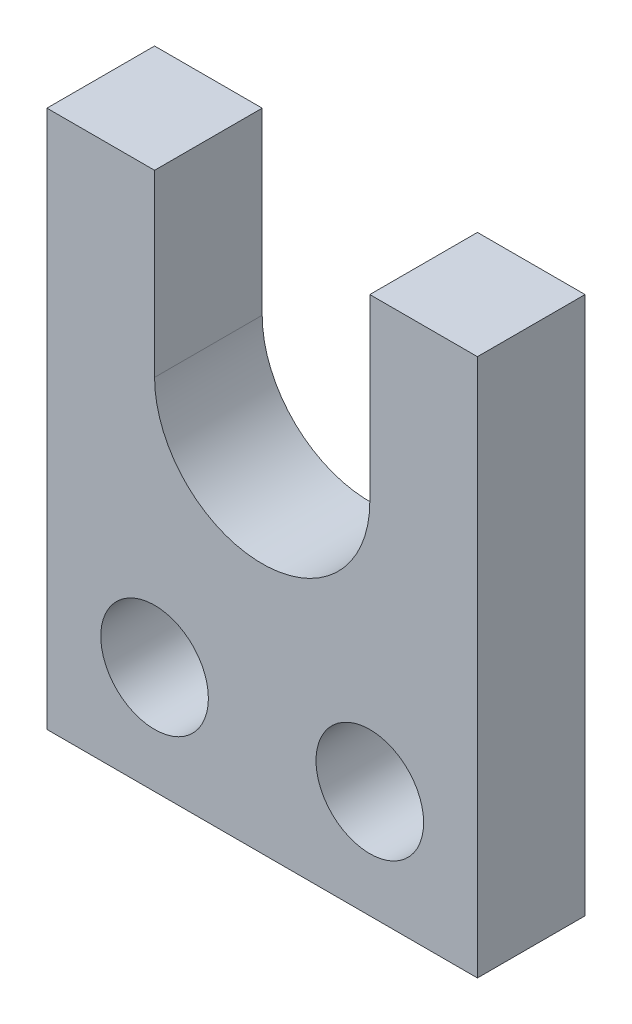
ISO-10303-21;
HEADER;
FILE_DESCRIPTION(('STEP AP214'),'2;1');
FILE_NAME('part.step','',(''),(''),'','','');
FILE_SCHEMA(('AUTOMOTIVE_DESIGN { 1 0 10303 214 1 1 1 1 }'));
ENDSEC;
DATA;
#1=APPLICATION_CONTEXT('core data for automotive mechanical design processes');
#2=APPLICATION_PROTOCOL_DEFINITION('international standard','automotive_design',2000,#1);
#3=PRODUCT_CONTEXT('',#1,'mechanical');
#4=PRODUCT('Part','Part','',(#3));
#5=PRODUCT_RELATED_PRODUCT_CATEGORY('part','',(#4));
#6=PRODUCT_DEFINITION_FORMATION('','',#4);
#7=PRODUCT_DEFINITION_CONTEXT('part definition',#1,'design');
#8=PRODUCT_DEFINITION('design','',#6,#7);
#9=PRODUCT_DEFINITION_SHAPE('','',#8);
#10=(LENGTH_UNIT() NAMED_UNIT(*) SI_UNIT(.MILLI.,.METRE.));
#11=(NAMED_UNIT(*) PLANE_ANGLE_UNIT() SI_UNIT($,.RADIAN.));
#12=(NAMED_UNIT(*) SI_UNIT($,.STERADIAN.) SOLID_ANGLE_UNIT());
#13=UNCERTAINTY_MEASURE_WITH_UNIT(LENGTH_MEASURE(1.E-05),#10,'distance_accuracy_value','');
#14=(GEOMETRIC_REPRESENTATION_CONTEXT(3) GLOBAL_UNCERTAINTY_ASSIGNED_CONTEXT((#13)) GLOBAL_UNIT_ASSIGNED_CONTEXT((#10,
#11,#12)) REPRESENTATION_CONTEXT('',''));
#15=CARTESIAN_POINT('',(0.,0.,0.));
#16=DIRECTION('',(0.,0.,1.));
#17=DIRECTION('',(1.,0.,0.));
#18=AXIS2_PLACEMENT_3D('',#15,#16,#17);
#19=CARTESIAN_POINT('',(-6.,7.5,3.));
#20=DIRECTION('',(0.,-1.,0.));
#21=DIRECTION('',(1.,0.,0.));
#22=AXIS2_PLACEMENT_3D('',#19,#20,#21);
#23=PLANE('',#22);
#24=DIRECTION('',(-1.,0.,0.));
#25=VECTOR('',#24,1.);
#26=CARTESIAN_POINT('',(-6.,7.5,3.));
#27=LINE('',#26,#25);
#28=CARTESIAN_POINT('',(-3.,7.5,3.));
#29=VERTEX_POINT('',#28);
#30=CARTESIAN_POINT('',(-6.,7.5,3.));
#31=VERTEX_POINT('',#30);
#32=EDGE_CURVE('E162',#29,#31,#27,.T.);
#33=ORIENTED_EDGE('',*,*,#32,.F.);
#34=DIRECTION('',(0.,0.,1.));
#35=VECTOR('',#34,1.);
#36=CARTESIAN_POINT('',(-3.,7.5,-0.00100000000000013));
#37=LINE('',#36,#35);
#38=CARTESIAN_POINT('',(-3.,7.5,0.));
#39=VERTEX_POINT('',#38);
#40=EDGE_CURVE('E129',#39,#29,#37,.T.);
#41=ORIENTED_EDGE('',*,*,#40,.F.);
#42=DIRECTION('',(-1.,0.,0.));
#43=VECTOR('',#42,1.);
#44=CARTESIAN_POINT('',(-6.,7.5,0.));
#45=LINE('',#44,#43);
#46=CARTESIAN_POINT('',(-6.,7.5,0.));
#47=VERTEX_POINT('',#46);
#48=EDGE_CURVE('E135',#39,#47,#45,.T.);
#49=ORIENTED_EDGE('',*,*,#48,.T.);
#50=DIRECTION('',(0.,0.,-1.));
#51=VECTOR('',#50,1.);
#52=CARTESIAN_POINT('',(-6.,7.5,3.));
#53=LINE('',#52,#51);
#54=EDGE_CURVE('E44',#31,#47,#53,.T.);
#55=ORIENTED_EDGE('',*,*,#54,.F.);
#56=EDGE_LOOP('',(#33,#41,#49,#55));
#57=FACE_BOUND('',#56,.T.);
#58=ADVANCED_FACE('F36',(#57),#23,.F.);
#59=CARTESIAN_POINT('',(0.,0.,3.));
#60=DIRECTION('',(0.,0.,1.));
#61=DIRECTION('',(1.,0.,0.));
#62=AXIS2_PLACEMENT_3D('',#59,#60,#61);
#63=PLANE('',#62);
#64=DIRECTION('',(0.,-1.,0.));
#65=VECTOR('',#64,1.);
#66=CARTESIAN_POINT('',(-3.,7.5,3.));
#67=LINE('',#66,#65);
#68=CARTESIAN_POINT('',(-3.,2.5,3.));
#69=VERTEX_POINT('',#68);
#70=EDGE_CURVE('E116',#29,#69,#67,.T.);
#71=ORIENTED_EDGE('',*,*,#70,.F.);
#72=ORIENTED_EDGE('',*,*,#32,.T.);
#73=DIRECTION('',(0.,-1.,0.));
#74=VECTOR('',#73,1.);
#75=CARTESIAN_POINT('',(-6.,7.5,3.));
#76=LINE('',#75,#74);
#77=CARTESIAN_POINT('',(-6.,-7.5,3.));
#78=VERTEX_POINT('',#77);
#79=EDGE_CURVE('E164',#31,#78,#76,.T.);
#80=ORIENTED_EDGE('',*,*,#79,.T.);
#81=DIRECTION('',(1.,0.,0.));
#82=VECTOR('',#81,1.);
#83=CARTESIAN_POINT('',(-6.,-7.5,3.));
#84=LINE('',#83,#82);
#85=CARTESIAN_POINT('',(6.,-7.5,3.));
#86=VERTEX_POINT('',#85);
#87=EDGE_CURVE('E60',#78,#86,#84,.T.);
#88=ORIENTED_EDGE('',*,*,#87,.T.);
#89=DIRECTION('',(0.,1.,0.));
#90=VECTOR('',#89,1.);
#91=CARTESIAN_POINT('',(6.,7.5,3.));
#92=LINE('',#91,#90);
#93=CARTESIAN_POINT('',(6.,7.5,3.));
#94=VERTEX_POINT('',#93);
#95=EDGE_CURVE('E160',#86,#94,#92,.T.);
#96=ORIENTED_EDGE('',*,*,#95,.T.);
#97=CARTESIAN_POINT('',(3.,7.5,3.));
#98=VERTEX_POINT('',#97);
#99=EDGE_CURVE('E87',#94,#98,#27,.T.);
#100=ORIENTED_EDGE('',*,*,#99,.T.);
#101=DIRECTION('',(0.,1.,0.));
#102=VECTOR('',#101,1.);
#103=CARTESIAN_POINT('',(3.,7.5,3.));
#104=LINE('',#103,#102);
#105=CARTESIAN_POINT('',(3.,2.5,3.));
#106=VERTEX_POINT('',#105);
#107=EDGE_CURVE('E51',#106,#98,#104,.T.);
#108=ORIENTED_EDGE('',*,*,#107,.F.);
#109=CARTESIAN_POINT('',(0.,2.5,3.));
#110=DIRECTION('',(0.,0.,1.));
#111=DIRECTION('',(-1.,0.,0.));
#112=AXIS2_PLACEMENT_3D('',#109,#110,#111);
#113=CIRCLE('',#112,3.);
#114=EDGE_CURVE('E138',#69,#106,#113,.T.);
#115=ORIENTED_EDGE('',*,*,#114,.F.);
#116=EDGE_LOOP('',(#71,#72,#80,#88,#96,#100,#108,#115));
#117=FACE_BOUND('',#116,.T.);
#118=CARTESIAN_POINT('',(-3.,-4.5,3.));
#119=DIRECTION('',(0.,0.,1.));
#120=DIRECTION('',(1.,0.,0.));
#121=AXIS2_PLACEMENT_3D('',#118,#119,#120);
#122=CIRCLE('',#121,1.5);
#123=CARTESIAN_POINT('',(-1.5,-4.5,3.));
#124=VERTEX_POINT('',#123);
#125=EDGE_CURVE('E154',#124,#124,#122,.T.);
#126=ORIENTED_EDGE('',*,*,#125,.F.);
#127=EDGE_LOOP('',(#126));
#128=FACE_BOUND('',#127,.T.);
#129=CARTESIAN_POINT('',(3.,-4.5,3.));
#130=DIRECTION('',(0.,0.,1.));
#131=DIRECTION('',(1.,0.,0.));
#132=AXIS2_PLACEMENT_3D('',#129,#130,#131);
#133=CIRCLE('',#132,1.5);
#134=CARTESIAN_POINT('',(4.5,-4.5,3.));
#135=VERTEX_POINT('',#134);
#136=EDGE_CURVE('E148',#135,#135,#133,.T.);
#137=ORIENTED_EDGE('',*,*,#136,.F.);
#138=EDGE_LOOP('',(#137));
#139=FACE_BOUND('',#138,.T.);
#140=ADVANCED_FACE('F205',(#117,#128,#139),#63,.T.);
#141=CARTESIAN_POINT('',(0.,0.,0.));
#142=DIRECTION('',(0.,0.,1.));
#143=DIRECTION('',(1.,0.,0.));
#144=AXIS2_PLACEMENT_3D('',#141,#142,#143);
#145=PLANE('',#144);
#146=ORIENTED_EDGE('',*,*,#48,.F.);
#147=DIRECTION('',(0.,1.,0.));
#148=VECTOR('',#147,1.);
#149=CARTESIAN_POINT('',(-3.,7.5,0.));
#150=LINE('',#149,#148);
#151=CARTESIAN_POINT('',(-3.,2.5,0.));
#152=VERTEX_POINT('',#151);
#153=EDGE_CURVE('E113',#152,#39,#150,.T.);
#154=ORIENTED_EDGE('',*,*,#153,.F.);
#155=CARTESIAN_POINT('',(0.,2.5,0.));
#156=DIRECTION('',(0.,0.,1.));
#157=DIRECTION('',(1.,0.,0.));
#158=AXIS2_PLACEMENT_3D('',#155,#156,#157);
#159=CIRCLE('',#158,3.);
#160=CARTESIAN_POINT('',(3.,2.5,0.));
#161=VERTEX_POINT('',#160);
#162=EDGE_CURVE('E123',#161,#152,#159,.F.);
#163=ORIENTED_EDGE('',*,*,#162,.F.);
#164=DIRECTION('',(0.,-1.,0.));
#165=VECTOR('',#164,1.);
#166=CARTESIAN_POINT('',(3.,7.5,0.));
#167=LINE('',#166,#165);
#168=CARTESIAN_POINT('',(3.,7.5,0.));
#169=VERTEX_POINT('',#168);
#170=EDGE_CURVE('E136',#169,#161,#167,.T.);
#171=ORIENTED_EDGE('',*,*,#170,.F.);
#172=CARTESIAN_POINT('',(6.,7.5,0.));
#173=VERTEX_POINT('',#172);
#174=EDGE_CURVE('E170',#173,#169,#45,.T.);
#175=ORIENTED_EDGE('',*,*,#174,.F.);
#176=DIRECTION('',(0.,1.,0.));
#177=VECTOR('',#176,1.);
#178=CARTESIAN_POINT('',(6.,7.5,0.));
#179=LINE('',#178,#177);
#180=CARTESIAN_POINT('',(6.,-7.5,0.));
#181=VERTEX_POINT('',#180);
#182=EDGE_CURVE('E157',#181,#173,#179,.T.);
#183=ORIENTED_EDGE('',*,*,#182,.F.);
#184=DIRECTION('',(1.,0.,0.));
#185=VECTOR('',#184,1.);
#186=CARTESIAN_POINT('',(-6.,-7.5,0.));
#187=LINE('',#186,#185);
#188=CARTESIAN_POINT('',(-6.,-7.5,0.));
#189=VERTEX_POINT('',#188);
#190=EDGE_CURVE('E81',#189,#181,#187,.T.);
#191=ORIENTED_EDGE('',*,*,#190,.F.);
#192=DIRECTION('',(0.,-1.,0.));
#193=VECTOR('',#192,1.);
#194=CARTESIAN_POINT('',(-6.,7.5,0.));
#195=LINE('',#194,#193);
#196=EDGE_CURVE('E173',#47,#189,#195,.T.);
#197=ORIENTED_EDGE('',*,*,#196,.F.);
#198=EDGE_LOOP('',(#146,#154,#163,#171,#175,#183,#191,#197));
#199=FACE_BOUND('',#198,.T.);
#200=CARTESIAN_POINT('',(-3.,-4.5,0.));
#201=DIRECTION('',(0.,0.,1.));
#202=DIRECTION('',(1.,0.,0.));
#203=AXIS2_PLACEMENT_3D('',#200,#201,#202);
#204=CIRCLE('',#203,1.5);
#205=CARTESIAN_POINT('',(-1.5,-4.5,0.));
#206=VERTEX_POINT('',#205);
#207=EDGE_CURVE('E151',#206,#206,#204,.T.);
#208=ORIENTED_EDGE('',*,*,#207,.T.);
#209=EDGE_LOOP('',(#208));
#210=FACE_BOUND('',#209,.T.);
#211=CARTESIAN_POINT('',(3.,-4.5,0.));
#212=DIRECTION('',(0.,0.,1.));
#213=DIRECTION('',(1.,0.,0.));
#214=AXIS2_PLACEMENT_3D('',#211,#212,#213);
#215=CIRCLE('',#214,1.5);
#216=CARTESIAN_POINT('',(4.5,-4.5,0.));
#217=VERTEX_POINT('',#216);
#218=EDGE_CURVE('E128',#217,#217,#215,.T.);
#219=ORIENTED_EDGE('',*,*,#218,.T.);
#220=EDGE_LOOP('',(#219));
#221=FACE_BOUND('',#220,.T.);
#222=ADVANCED_FACE('F132',(#199,#210,#221),#145,.F.);
#223=CARTESIAN_POINT('',(6.,7.5,3.));
#224=DIRECTION('',(-1.,0.,0.));
#225=DIRECTION('',(0.,-1.,0.));
#226=AXIS2_PLACEMENT_3D('',#223,#224,#225);
#227=PLANE('',#226);
#228=ORIENTED_EDGE('',*,*,#182,.T.);
#229=DIRECTION('',(0.,0.,-1.));
#230=VECTOR('',#229,1.);
#231=CARTESIAN_POINT('',(6.,7.5,3.));
#232=LINE('',#231,#230);
#233=EDGE_CURVE('E11',#94,#173,#232,.T.);
#234=ORIENTED_EDGE('',*,*,#233,.F.);
#235=ORIENTED_EDGE('',*,*,#95,.F.);
#236=DIRECTION('',(0.,0.,-1.));
#237=VECTOR('',#236,1.);
#238=CARTESIAN_POINT('',(6.,-7.5,3.));
#239=LINE('',#238,#237);
#240=EDGE_CURVE('E167',#86,#181,#239,.T.);
#241=ORIENTED_EDGE('',*,*,#240,.T.);
#242=EDGE_LOOP('',(#228,#234,#235,#241));
#243=FACE_BOUND('',#242,.T.);
#244=ADVANCED_FACE('F38',(#243),#227,.F.);
#245=ORIENTED_EDGE('',*,*,#174,.T.);
#246=DIRECTION('',(0.,0.,1.));
#247=VECTOR('',#246,1.);
#248=CARTESIAN_POINT('',(3.,7.5,-0.00100000000000013));
#249=LINE('',#248,#247);
#250=EDGE_CURVE('E145',#169,#98,#249,.T.);
#251=ORIENTED_EDGE('',*,*,#250,.T.);
#252=ORIENTED_EDGE('',*,*,#99,.F.);
#253=ORIENTED_EDGE('',*,*,#233,.T.);
#254=EDGE_LOOP('',(#245,#251,#252,#253));
#255=FACE_BOUND('',#254,.T.);
#256=ADVANCED_FACE('F201',(#255),#23,.F.);
#257=CARTESIAN_POINT('',(-6.,7.5,3.));
#258=DIRECTION('',(1.,0.,0.));
#259=DIRECTION('',(0.,1.,0.));
#260=AXIS2_PLACEMENT_3D('',#257,#258,#259);
#261=PLANE('',#260);
#262=ORIENTED_EDGE('',*,*,#196,.T.);
#263=DIRECTION('',(0.,0.,-1.));
#264=VECTOR('',#263,1.);
#265=CARTESIAN_POINT('',(-6.,-7.5,3.));
#266=LINE('',#265,#264);
#267=EDGE_CURVE('E177',#78,#189,#266,.T.);
#268=ORIENTED_EDGE('',*,*,#267,.F.);
#269=ORIENTED_EDGE('',*,*,#79,.F.);
#270=ORIENTED_EDGE('',*,*,#54,.T.);
#271=EDGE_LOOP('',(#262,#268,#269,#270));
#272=FACE_BOUND('',#271,.T.);
#273=ADVANCED_FACE('F182',(#272),#261,.F.);
#274=CARTESIAN_POINT('',(-6.,-7.5,3.));
#275=DIRECTION('',(0.,1.,0.));
#276=DIRECTION('',(0.,0.,1.));
#277=AXIS2_PLACEMENT_3D('',#274,#275,#276);
#278=PLANE('',#277);
#279=ORIENTED_EDGE('',*,*,#190,.T.);
#280=ORIENTED_EDGE('',*,*,#240,.F.);
#281=ORIENTED_EDGE('',*,*,#87,.F.);
#282=ORIENTED_EDGE('',*,*,#267,.T.);
#283=EDGE_LOOP('',(#279,#280,#281,#282));
#284=FACE_BOUND('',#283,.T.);
#285=ADVANCED_FACE('F190',(#284),#278,.F.);
#286=CARTESIAN_POINT('',(-3.,-4.5,3.));
#287=DIRECTION('',(0.,0.,-1.));
#288=DIRECTION('',(-1.,0.,0.));
#289=AXIS2_PLACEMENT_3D('',#286,#287,#288);
#290=CYLINDRICAL_SURFACE('',#289,1.5);
#291=ORIENTED_EDGE('',*,*,#125,.T.);
#292=EDGE_LOOP('',(#291));
#293=FACE_BOUND('',#292,.T.);
#294=ORIENTED_EDGE('',*,*,#207,.F.);
#295=EDGE_LOOP('',(#294));
#296=FACE_BOUND('',#295,.T.);
#297=ADVANCED_FACE('F192',(#293,#296),#290,.F.);
#298=CARTESIAN_POINT('',(3.,-4.5,3.));
#299=DIRECTION('',(0.,0.,-1.));
#300=DIRECTION('',(-1.,0.,0.));
#301=AXIS2_PLACEMENT_3D('',#298,#299,#300);
#302=CYLINDRICAL_SURFACE('',#301,1.5);
#303=ORIENTED_EDGE('',*,*,#136,.T.);
#304=EDGE_LOOP('',(#303));
#305=FACE_BOUND('',#304,.T.);
#306=ORIENTED_EDGE('',*,*,#218,.F.);
#307=EDGE_LOOP('',(#306));
#308=FACE_BOUND('',#307,.T.);
#309=ADVANCED_FACE('F198',(#305,#308),#302,.F.);
#310=CARTESIAN_POINT('',(-3.,7.5,-0.00100000000000013));
#311=DIRECTION('',(-1.,0.,0.));
#312=DIRECTION('',(0.,-1.,0.));
#313=AXIS2_PLACEMENT_3D('',#310,#311,#312);
#314=PLANE('',#313);
#315=ORIENTED_EDGE('',*,*,#153,.T.);
#316=ORIENTED_EDGE('',*,*,#40,.T.);
#317=ORIENTED_EDGE('',*,*,#70,.T.);
#318=DIRECTION('',(0.,0.,1.));
#319=VECTOR('',#318,1.);
#320=CARTESIAN_POINT('',(-3.,2.5,-0.00100000000000013));
#321=LINE('',#320,#319);
#322=EDGE_CURVE('E109',#152,#69,#321,.T.);
#323=ORIENTED_EDGE('',*,*,#322,.F.);
#324=EDGE_LOOP('',(#315,#316,#317,#323));
#325=FACE_BOUND('',#324,.T.);
#326=ADVANCED_FACE('F111',(#325),#314,.F.);
#327=CARTESIAN_POINT('',(3.,7.5,-0.00100000000000013));
#328=DIRECTION('',(1.,0.,0.));
#329=DIRECTION('',(0.,1.,0.));
#330=AXIS2_PLACEMENT_3D('',#327,#328,#329);
#331=PLANE('',#330);
#332=ORIENTED_EDGE('',*,*,#170,.T.);
#333=DIRECTION('',(0.,0.,1.));
#334=VECTOR('',#333,1.);
#335=CARTESIAN_POINT('',(3.,2.5,-0.00100000000000013));
#336=LINE('',#335,#334);
#337=EDGE_CURVE('E120',#161,#106,#336,.T.);
#338=ORIENTED_EDGE('',*,*,#337,.T.);
#339=ORIENTED_EDGE('',*,*,#107,.T.);
#340=ORIENTED_EDGE('',*,*,#250,.F.);
#341=EDGE_LOOP('',(#332,#338,#339,#340));
#342=FACE_BOUND('',#341,.T.);
#343=ADVANCED_FACE('F230',(#342),#331,.F.);
#344=CARTESIAN_POINT('',(0.,2.5,-0.00100000000000013));
#345=DIRECTION('',(0.,0.,1.));
#346=DIRECTION('',(1.,0.,0.));
#347=AXIS2_PLACEMENT_3D('',#344,#345,#346);
#348=CYLINDRICAL_SURFACE('',#347,3.);
#349=ORIENTED_EDGE('',*,*,#162,.T.);
#350=ORIENTED_EDGE('',*,*,#322,.T.);
#351=ORIENTED_EDGE('',*,*,#114,.T.);
#352=ORIENTED_EDGE('',*,*,#337,.F.);
#353=EDGE_LOOP('',(#349,#350,#351,#352));
#354=FACE_BOUND('',#353,.T.);
#355=ADVANCED_FACE('F124',(#354),#348,.F.);
#356=CLOSED_SHELL('',(#58,#140,#222,#244,#256,#273,#285,#297,#309,#326,#343,#355));
#357=MANIFOLD_SOLID_BREP('B2',#356);
#358=ADVANCED_BREP_SHAPE_REPRESENTATION('',(#18,#357),#14);
#359=SHAPE_DEFINITION_REPRESENTATION(#9,#358);
ENDSEC;
END-ISO-10303-21;
